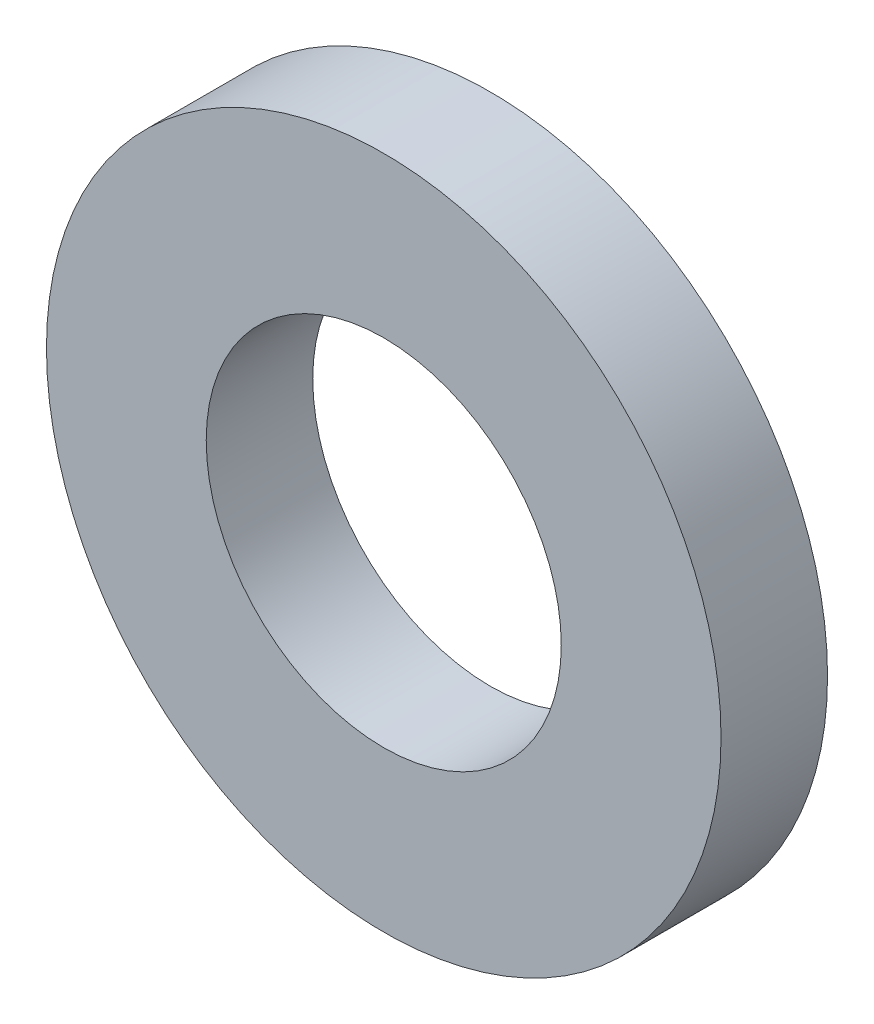
ISO-10303-21;
HEADER;
FILE_DESCRIPTION(('STEP AP214'),'2;1');
FILE_NAME('part.step','',(''),(''),'','','');
FILE_SCHEMA(('AUTOMOTIVE_DESIGN { 1 0 10303 214 1 1 1 1 }'));
ENDSEC;
DATA;
#1=APPLICATION_CONTEXT('core data for automotive mechanical design processes');
#2=APPLICATION_PROTOCOL_DEFINITION('international standard','automotive_design',2000,#1);
#3=PRODUCT_CONTEXT('',#1,'mechanical');
#4=PRODUCT('Part','Part','',(#3));
#5=PRODUCT_RELATED_PRODUCT_CATEGORY('part','',(#4));
#6=PRODUCT_DEFINITION_FORMATION('','',#4);
#7=PRODUCT_DEFINITION_CONTEXT('part definition',#1,'design');
#8=PRODUCT_DEFINITION('design','',#6,#7);
#9=PRODUCT_DEFINITION_SHAPE('','',#8);
#10=(LENGTH_UNIT() NAMED_UNIT(*) SI_UNIT(.MILLI.,.METRE.));
#11=(NAMED_UNIT(*) PLANE_ANGLE_UNIT() SI_UNIT($,.RADIAN.));
#12=(NAMED_UNIT(*) SI_UNIT($,.STERADIAN.) SOLID_ANGLE_UNIT());
#13=UNCERTAINTY_MEASURE_WITH_UNIT(LENGTH_MEASURE(1.E-05),#10,'distance_accuracy_value','');
#14=(GEOMETRIC_REPRESENTATION_CONTEXT(3) GLOBAL_UNCERTAINTY_ASSIGNED_CONTEXT((#13)) GLOBAL_UNIT_ASSIGNED_CONTEXT((#10,
#11,#12)) REPRESENTATION_CONTEXT('',''));
#15=CARTESIAN_POINT('',(0.,0.,0.));
#16=DIRECTION('',(0.,0.,1.));
#17=DIRECTION('',(1.,0.,0.));
#18=AXIS2_PLACEMENT_3D('',#15,#16,#17);
#19=CARTESIAN_POINT('',(0.,0.,1.5));
#20=DIRECTION('',(0.,0.,1.));
#21=DIRECTION('',(1.,0.,0.));
#22=AXIS2_PLACEMENT_3D('',#19,#20,#21);
#23=PLANE('',#22);
#24=CARTESIAN_POINT('',(0.,0.,1.5));
#25=DIRECTION('',(0.,0.,1.));
#26=DIRECTION('',(1.,0.,0.));
#27=AXIS2_PLACEMENT_3D('',#24,#25,#26);
#28=CIRCLE('',#27,9.5);
#29=CARTESIAN_POINT('',(9.5,0.,1.5));
#30=VERTEX_POINT('',#29);
#31=EDGE_CURVE('E10',#30,#30,#28,.T.);
#32=ORIENTED_EDGE('',*,*,#31,.T.);
#33=EDGE_LOOP('',(#32));
#34=FACE_BOUND('',#33,.T.);
#35=CARTESIAN_POINT('',(0.,0.,1.5));
#36=DIRECTION('',(0.,0.,1.));
#37=DIRECTION('',(1.,0.,0.));
#38=AXIS2_PLACEMENT_3D('',#35,#36,#37);
#39=CIRCLE('',#38,5.);
#40=CARTESIAN_POINT('',(5.,0.,1.5));
#41=VERTEX_POINT('',#40);
#42=EDGE_CURVE('E42',#41,#41,#39,.T.);
#43=ORIENTED_EDGE('',*,*,#42,.F.);
#44=EDGE_LOOP('',(#43));
#45=FACE_BOUND('',#44,.T.);
#46=ADVANCED_FACE('F31',(#34,#45),#23,.T.);
#47=CARTESIAN_POINT('',(0.,0.,-1.5));
#48=DIRECTION('',(0.,0.,1.));
#49=DIRECTION('',(1.,0.,0.));
#50=AXIS2_PLACEMENT_3D('',#47,#48,#49);
#51=PLANE('',#50);
#52=CARTESIAN_POINT('',(0.,0.,-1.5));
#53=DIRECTION('',(0.,0.,1.));
#54=DIRECTION('',(1.,0.,0.));
#55=AXIS2_PLACEMENT_3D('',#52,#53,#54);
#56=CIRCLE('',#55,9.5);
#57=CARTESIAN_POINT('',(9.5,0.,-1.5));
#58=VERTEX_POINT('',#57);
#59=EDGE_CURVE('E35',#58,#58,#56,.T.);
#60=ORIENTED_EDGE('',*,*,#59,.F.);
#61=EDGE_LOOP('',(#60));
#62=FACE_BOUND('',#61,.T.);
#63=CARTESIAN_POINT('',(0.,0.,-1.5));
#64=DIRECTION('',(0.,0.,1.));
#65=DIRECTION('',(1.,0.,0.));
#66=AXIS2_PLACEMENT_3D('',#63,#64,#65);
#67=CIRCLE('',#66,5.);
#68=CARTESIAN_POINT('',(5.,0.,-1.5));
#69=VERTEX_POINT('',#68);
#70=EDGE_CURVE('E44',#69,#69,#67,.T.);
#71=ORIENTED_EDGE('',*,*,#70,.T.);
#72=EDGE_LOOP('',(#71));
#73=FACE_BOUND('',#72,.T.);
#74=ADVANCED_FACE('F54',(#62,#73),#51,.F.);
#75=CARTESIAN_POINT('',(0.,0.,1.5));
#76=DIRECTION('',(0.,0.,-1.));
#77=DIRECTION('',(-1.,0.,0.));
#78=AXIS2_PLACEMENT_3D('',#75,#76,#77);
#79=CYLINDRICAL_SURFACE('',#78,9.5);
#80=ORIENTED_EDGE('',*,*,#31,.F.);
#81=EDGE_LOOP('',(#80));
#82=FACE_BOUND('',#81,.T.);
#83=ORIENTED_EDGE('',*,*,#59,.T.);
#84=EDGE_LOOP('',(#83));
#85=FACE_BOUND('',#84,.T.);
#86=ADVANCED_FACE('F33',(#82,#85),#79,.T.);
#87=CARTESIAN_POINT('',(0.,0.,1.5));
#88=DIRECTION('',(0.,0.,-1.));
#89=DIRECTION('',(-1.,0.,0.));
#90=AXIS2_PLACEMENT_3D('',#87,#88,#89);
#91=CYLINDRICAL_SURFACE('',#90,5.);
#92=ORIENTED_EDGE('',*,*,#42,.T.);
#93=EDGE_LOOP('',(#92));
#94=FACE_BOUND('',#93,.T.);
#95=ORIENTED_EDGE('',*,*,#70,.F.);
#96=EDGE_LOOP('',(#95));
#97=FACE_BOUND('',#96,.T.);
#98=ADVANCED_FACE('F50',(#94,#97),#91,.F.);
#99=CLOSED_SHELL('',(#46,#74,#86,#98));
#100=MANIFOLD_SOLID_BREP('B2',#99);
#101=ADVANCED_BREP_SHAPE_REPRESENTATION('',(#18,#100),#14);
#102=SHAPE_DEFINITION_REPRESENTATION(#9,#101);
ENDSEC;
END-ISO-10303-21;
